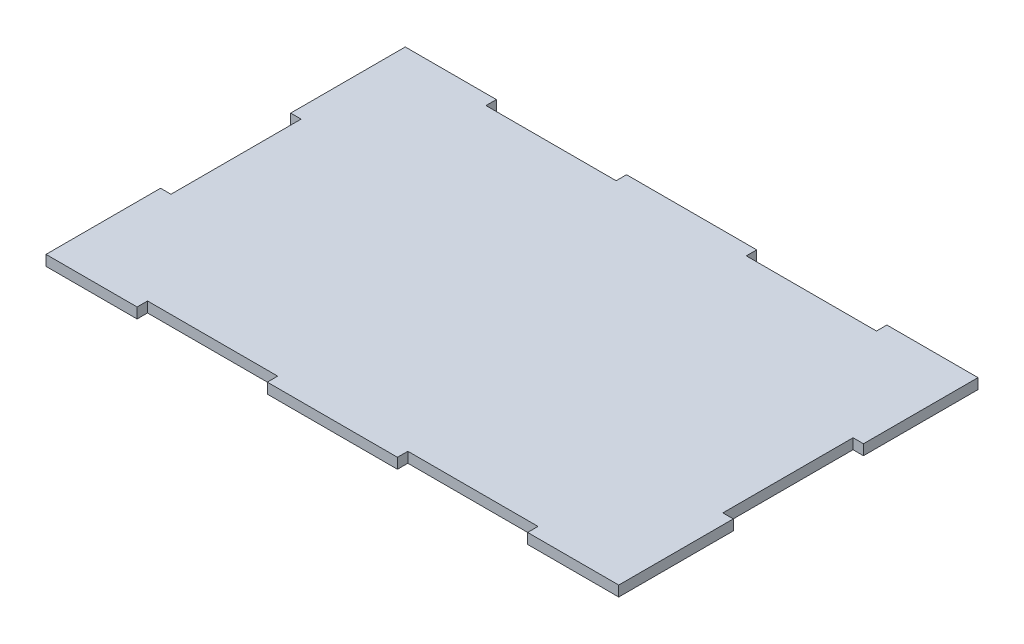
ISO-10303-21;
HEADER;
FILE_DESCRIPTION(('STEP AP214'),'2;1');
FILE_NAME('part.step','',(''),(''),'','','');
FILE_SCHEMA(('AUTOMOTIVE_DESIGN { 1 0 10303 214 1 1 1 1 }'));
ENDSEC;
DATA;
#1=APPLICATION_CONTEXT('core data for automotive mechanical design processes');
#2=APPLICATION_PROTOCOL_DEFINITION('international standard','automotive_design',2000,#1);
#3=PRODUCT_CONTEXT('',#1,'mechanical');
#4=PRODUCT('Part','Part','',(#3));
#5=PRODUCT_RELATED_PRODUCT_CATEGORY('part','',(#4));
#6=PRODUCT_DEFINITION_FORMATION('','',#4);
#7=PRODUCT_DEFINITION_CONTEXT('part definition',#1,'design');
#8=PRODUCT_DEFINITION('design','',#6,#7);
#9=PRODUCT_DEFINITION_SHAPE('','',#8);
#10=(LENGTH_UNIT() NAMED_UNIT(*) SI_UNIT(.MILLI.,.METRE.));
#11=(NAMED_UNIT(*) PLANE_ANGLE_UNIT() SI_UNIT($,.RADIAN.));
#12=(NAMED_UNIT(*) SI_UNIT($,.STERADIAN.) SOLID_ANGLE_UNIT());
#13=UNCERTAINTY_MEASURE_WITH_UNIT(LENGTH_MEASURE(1.E-05),#10,'distance_accuracy_value','');
#14=(GEOMETRIC_REPRESENTATION_CONTEXT(3) GLOBAL_UNCERTAINTY_ASSIGNED_CONTEXT((#13)) GLOBAL_UNIT_ASSIGNED_CONTEXT((#10,
#11,#12)) REPRESENTATION_CONTEXT('',''));
#15=CARTESIAN_POINT('',(0.,0.,0.));
#16=DIRECTION('',(0.,0.,1.));
#17=DIRECTION('',(1.,0.,0.));
#18=AXIS2_PLACEMENT_3D('',#15,#16,#17);
#19=CARTESIAN_POINT('',(-75.,4.,-69.));
#20=DIRECTION('',(0.,0.,1.));
#21=DIRECTION('',(1.,0.,0.));
#22=AXIS2_PLACEMENT_3D('',#19,#20,#21);
#23=PLANE('',#22);
#24=DIRECTION('',(-1.,0.,0.));
#25=VECTOR('',#24,1.);
#26=CARTESIAN_POINT('',(-75.,0.,-69.));
#27=LINE('',#26,#25);
#28=CARTESIAN_POINT('',(-75.,0.,-69.));
#29=VERTEX_POINT('',#28);
#30=CARTESIAN_POINT('',(-110.,0.,-69.));
#31=VERTEX_POINT('',#30);
#32=EDGE_CURVE('E266',#29,#31,#27,.T.);
#33=ORIENTED_EDGE('',*,*,#32,.T.);
#34=DIRECTION('',(0.,-1.,0.));
#35=VECTOR('',#34,1.);
#36=CARTESIAN_POINT('',(-110.,4.,-69.));
#37=LINE('',#36,#35);
#38=CARTESIAN_POINT('',(-110.,4.,-69.));
#39=VERTEX_POINT('',#38);
#40=EDGE_CURVE('E11',#39,#31,#37,.T.);
#41=ORIENTED_EDGE('',*,*,#40,.F.);
#42=DIRECTION('',(-1.,0.,0.));
#43=VECTOR('',#42,1.);
#44=CARTESIAN_POINT('',(-75.,4.,-69.));
#45=LINE('',#44,#43);
#46=CARTESIAN_POINT('',(-75.,4.,-69.));
#47=VERTEX_POINT('',#46);
#48=EDGE_CURVE('E348',#47,#39,#45,.T.);
#49=ORIENTED_EDGE('',*,*,#48,.F.);
#50=DIRECTION('',(0.,-1.,0.));
#51=VECTOR('',#50,1.);
#52=CARTESIAN_POINT('',(-75.,4.,-69.));
#53=LINE('',#52,#51);
#54=EDGE_CURVE('E262',#47,#29,#53,.T.);
#55=ORIENTED_EDGE('',*,*,#54,.T.);
#56=EDGE_LOOP('',(#33,#41,#49,#55));
#57=FACE_BOUND('',#56,.T.);
#58=ADVANCED_FACE('F45',(#57),#23,.F.);
#59=CARTESIAN_POINT('',(-110.,4.,-69.));
#60=DIRECTION('',(1.,0.,0.));
#61=DIRECTION('',(0.,0.,-1.));
#62=AXIS2_PLACEMENT_3D('',#59,#60,#61);
#63=PLANE('',#62);
#64=DIRECTION('',(0.,0.,1.));
#65=VECTOR('',#64,1.);
#66=CARTESIAN_POINT('',(-110.,0.,-69.));
#67=LINE('',#66,#65);
#68=CARTESIAN_POINT('',(-110.,0.,-25.));
#69=VERTEX_POINT('',#68);
#70=EDGE_CURVE('E270',#31,#69,#67,.T.);
#71=ORIENTED_EDGE('',*,*,#70,.T.);
#72=DIRECTION('',(0.,-1.,0.));
#73=VECTOR('',#72,1.);
#74=CARTESIAN_POINT('',(-110.,4.,-25.));
#75=LINE('',#74,#73);
#76=CARTESIAN_POINT('',(-110.,4.,-25.));
#77=VERTEX_POINT('',#76);
#78=EDGE_CURVE('E54',#77,#69,#75,.T.);
#79=ORIENTED_EDGE('',*,*,#78,.F.);
#80=DIRECTION('',(0.,0.,1.));
#81=VECTOR('',#80,1.);
#82=CARTESIAN_POINT('',(-110.,4.,-69.));
#83=LINE('',#82,#81);
#84=EDGE_CURVE('E165',#39,#77,#83,.T.);
#85=ORIENTED_EDGE('',*,*,#84,.F.);
#86=ORIENTED_EDGE('',*,*,#40,.T.);
#87=EDGE_LOOP('',(#71,#79,#85,#86));
#88=FACE_BOUND('',#87,.T.);
#89=ADVANCED_FACE('F554',(#88),#63,.F.);
#90=CARTESIAN_POINT('',(-110.,4.,-25.));
#91=DIRECTION('',(0.,0.,-1.));
#92=DIRECTION('',(-1.,0.,0.));
#93=AXIS2_PLACEMENT_3D('',#90,#91,#92);
#94=PLANE('',#93);
#95=DIRECTION('',(1.,0.,0.));
#96=VECTOR('',#95,1.);
#97=CARTESIAN_POINT('',(-110.,0.,-25.));
#98=LINE('',#97,#96);
#99=CARTESIAN_POINT('',(-106.,0.,-25.));
#100=VERTEX_POINT('',#99);
#101=EDGE_CURVE('E273',#69,#100,#98,.T.);
#102=ORIENTED_EDGE('',*,*,#101,.T.);
#103=DIRECTION('',(0.,-1.,0.));
#104=VECTOR('',#103,1.);
#105=CARTESIAN_POINT('',(-106.,4.,-25.));
#106=LINE('',#105,#104);
#107=CARTESIAN_POINT('',(-106.,4.,-25.));
#108=VERTEX_POINT('',#107);
#109=EDGE_CURVE('E439',#108,#100,#106,.T.);
#110=ORIENTED_EDGE('',*,*,#109,.F.);
#111=DIRECTION('',(1.,0.,0.));
#112=VECTOR('',#111,1.);
#113=CARTESIAN_POINT('',(-110.,4.,-25.));
#114=LINE('',#113,#112);
#115=EDGE_CURVE('E449',#77,#108,#114,.T.);
#116=ORIENTED_EDGE('',*,*,#115,.F.);
#117=ORIENTED_EDGE('',*,*,#78,.T.);
#118=EDGE_LOOP('',(#102,#110,#116,#117));
#119=FACE_BOUND('',#118,.T.);
#120=ADVANCED_FACE('F447',(#119),#94,.F.);
#121=CARTESIAN_POINT('',(-106.,4.,-25.));
#122=DIRECTION('',(1.,0.,0.));
#123=DIRECTION('',(0.,0.,-1.));
#124=AXIS2_PLACEMENT_3D('',#121,#122,#123);
#125=PLANE('',#124);
#126=DIRECTION('',(0.,0.,1.));
#127=VECTOR('',#126,1.);
#128=CARTESIAN_POINT('',(-106.,0.,-25.));
#129=LINE('',#128,#127);
#130=CARTESIAN_POINT('',(-106.,0.,25.));
#131=VERTEX_POINT('',#130);
#132=EDGE_CURVE('E276',#100,#131,#129,.T.);
#133=ORIENTED_EDGE('',*,*,#132,.T.);
#134=DIRECTION('',(0.,-1.,0.));
#135=VECTOR('',#134,1.);
#136=CARTESIAN_POINT('',(-106.,4.,25.));
#137=LINE('',#136,#135);
#138=CARTESIAN_POINT('',(-106.,4.,25.));
#139=VERTEX_POINT('',#138);
#140=EDGE_CURVE('E435',#139,#131,#137,.T.);
#141=ORIENTED_EDGE('',*,*,#140,.F.);
#142=DIRECTION('',(0.,0.,1.));
#143=VECTOR('',#142,1.);
#144=CARTESIAN_POINT('',(-106.,4.,-25.));
#145=LINE('',#144,#143);
#146=EDGE_CURVE('E468',#108,#139,#145,.T.);
#147=ORIENTED_EDGE('',*,*,#146,.F.);
#148=ORIENTED_EDGE('',*,*,#109,.T.);
#149=EDGE_LOOP('',(#133,#141,#147,#148));
#150=FACE_BOUND('',#149,.T.);
#151=ADVANCED_FACE('F458',(#150),#125,.F.);
#152=CARTESIAN_POINT('',(-106.,4.,25.));
#153=DIRECTION('',(0.,0.,1.));
#154=DIRECTION('',(1.,0.,0.));
#155=AXIS2_PLACEMENT_3D('',#152,#153,#154);
#156=PLANE('',#155);
#157=DIRECTION('',(-1.,0.,0.));
#158=VECTOR('',#157,1.);
#159=CARTESIAN_POINT('',(-106.,0.,25.));
#160=LINE('',#159,#158);
#161=CARTESIAN_POINT('',(-110.,0.,25.));
#162=VERTEX_POINT('',#161);
#163=EDGE_CURVE('E279',#131,#162,#160,.T.);
#164=ORIENTED_EDGE('',*,*,#163,.T.);
#165=DIRECTION('',(0.,-1.,0.));
#166=VECTOR('',#165,1.);
#167=CARTESIAN_POINT('',(-110.,4.,25.));
#168=LINE('',#167,#166);
#169=CARTESIAN_POINT('',(-110.,4.,25.));
#170=VERTEX_POINT('',#169);
#171=EDGE_CURVE('E431',#170,#162,#168,.T.);
#172=ORIENTED_EDGE('',*,*,#171,.F.);
#173=DIRECTION('',(-1.,0.,0.));
#174=VECTOR('',#173,1.);
#175=CARTESIAN_POINT('',(-106.,4.,25.));
#176=LINE('',#175,#174);
#177=EDGE_CURVE('E464',#139,#170,#176,.T.);
#178=ORIENTED_EDGE('',*,*,#177,.F.);
#179=ORIENTED_EDGE('',*,*,#140,.T.);
#180=EDGE_LOOP('',(#164,#172,#178,#179));
#181=FACE_BOUND('',#180,.T.);
#182=ADVANCED_FACE('F462',(#181),#156,.F.);
#183=CARTESIAN_POINT('',(-110.,4.,25.));
#184=DIRECTION('',(1.,0.,0.));
#185=DIRECTION('',(0.,0.,-1.));
#186=AXIS2_PLACEMENT_3D('',#183,#184,#185);
#187=PLANE('',#186);
#188=DIRECTION('',(0.,0.,1.));
#189=VECTOR('',#188,1.);
#190=CARTESIAN_POINT('',(-110.,0.,25.));
#191=LINE('',#190,#189);
#192=CARTESIAN_POINT('',(-110.,0.,69.));
#193=VERTEX_POINT('',#192);
#194=EDGE_CURVE('E282',#162,#193,#191,.T.);
#195=ORIENTED_EDGE('',*,*,#194,.T.);
#196=DIRECTION('',(0.,-1.,0.));
#197=VECTOR('',#196,1.);
#198=CARTESIAN_POINT('',(-110.,4.,69.));
#199=LINE('',#198,#197);
#200=CARTESIAN_POINT('',(-110.,4.,69.));
#201=VERTEX_POINT('',#200);
#202=EDGE_CURVE('E427',#201,#193,#199,.T.);
#203=ORIENTED_EDGE('',*,*,#202,.F.);
#204=DIRECTION('',(0.,0.,1.));
#205=VECTOR('',#204,1.);
#206=CARTESIAN_POINT('',(-110.,4.,25.));
#207=LINE('',#206,#205);
#208=EDGE_CURVE('E467',#170,#201,#207,.T.);
#209=ORIENTED_EDGE('',*,*,#208,.F.);
#210=ORIENTED_EDGE('',*,*,#171,.T.);
#211=EDGE_LOOP('',(#195,#203,#209,#210));
#212=FACE_BOUND('',#211,.T.);
#213=ADVANCED_FACE('F567',(#212),#187,.F.);
#214=CARTESIAN_POINT('',(-110.,4.,69.));
#215=DIRECTION('',(0.,0.,-1.));
#216=DIRECTION('',(-1.,0.,0.));
#217=AXIS2_PLACEMENT_3D('',#214,#215,#216);
#218=PLANE('',#217);
#219=DIRECTION('',(1.,0.,0.));
#220=VECTOR('',#219,1.);
#221=CARTESIAN_POINT('',(-110.,0.,69.));
#222=LINE('',#221,#220);
#223=CARTESIAN_POINT('',(-75.,0.,69.));
#224=VERTEX_POINT('',#223);
#225=EDGE_CURVE('E285',#193,#224,#222,.T.);
#226=ORIENTED_EDGE('',*,*,#225,.T.);
#227=DIRECTION('',(0.,-1.,0.));
#228=VECTOR('',#227,1.);
#229=CARTESIAN_POINT('',(-75.,4.,69.));
#230=LINE('',#229,#228);
#231=CARTESIAN_POINT('',(-75.,4.,69.));
#232=VERTEX_POINT('',#231);
#233=EDGE_CURVE('E423',#232,#224,#230,.T.);
#234=ORIENTED_EDGE('',*,*,#233,.F.);
#235=DIRECTION('',(1.,0.,0.));
#236=VECTOR('',#235,1.);
#237=CARTESIAN_POINT('',(-110.,4.,69.));
#238=LINE('',#237,#236);
#239=EDGE_CURVE('E472',#201,#232,#238,.T.);
#240=ORIENTED_EDGE('',*,*,#239,.F.);
#241=ORIENTED_EDGE('',*,*,#202,.T.);
#242=EDGE_LOOP('',(#226,#234,#240,#241));
#243=FACE_BOUND('',#242,.T.);
#244=ADVANCED_FACE('F570',(#243),#218,.F.);
#245=CARTESIAN_POINT('',(-75.,4.,69.));
#246=DIRECTION('',(-1.,0.,0.));
#247=DIRECTION('',(0.,0.,1.));
#248=AXIS2_PLACEMENT_3D('',#245,#246,#247);
#249=PLANE('',#248);
#250=DIRECTION('',(0.,0.,-1.));
#251=VECTOR('',#250,1.);
#252=CARTESIAN_POINT('',(-75.,0.,69.));
#253=LINE('',#252,#251);
#254=CARTESIAN_POINT('',(-75.,0.,65.));
#255=VERTEX_POINT('',#254);
#256=EDGE_CURVE('E288',#224,#255,#253,.T.);
#257=ORIENTED_EDGE('',*,*,#256,.T.);
#258=DIRECTION('',(0.,-1.,0.));
#259=VECTOR('',#258,1.);
#260=CARTESIAN_POINT('',(-75.,4.,65.));
#261=LINE('',#260,#259);
#262=CARTESIAN_POINT('',(-75.,4.,65.));
#263=VERTEX_POINT('',#262);
#264=EDGE_CURVE('E419',#263,#255,#261,.T.);
#265=ORIENTED_EDGE('',*,*,#264,.F.);
#266=DIRECTION('',(0.,0.,-1.));
#267=VECTOR('',#266,1.);
#268=CARTESIAN_POINT('',(-75.,4.,69.));
#269=LINE('',#268,#267);
#270=EDGE_CURVE('E479',#232,#263,#269,.T.);
#271=ORIENTED_EDGE('',*,*,#270,.F.);
#272=ORIENTED_EDGE('',*,*,#233,.T.);
#273=EDGE_LOOP('',(#257,#265,#271,#272));
#274=FACE_BOUND('',#273,.T.);
#275=ADVANCED_FACE('F574',(#274),#249,.F.);
#276=CARTESIAN_POINT('',(-75.,4.,65.));
#277=DIRECTION('',(0.,0.,-1.));
#278=DIRECTION('',(-1.,0.,0.));
#279=AXIS2_PLACEMENT_3D('',#276,#277,#278);
#280=PLANE('',#279);
#281=DIRECTION('',(1.,0.,0.));
#282=VECTOR('',#281,1.);
#283=CARTESIAN_POINT('',(-75.,0.,65.));
#284=LINE('',#283,#282);
#285=CARTESIAN_POINT('',(-25.,0.,65.));
#286=VERTEX_POINT('',#285);
#287=EDGE_CURVE('E291',#255,#286,#284,.T.);
#288=ORIENTED_EDGE('',*,*,#287,.T.);
#289=DIRECTION('',(0.,-1.,0.));
#290=VECTOR('',#289,1.);
#291=CARTESIAN_POINT('',(-25.,4.,65.));
#292=LINE('',#291,#290);
#293=CARTESIAN_POINT('',(-25.,4.,65.));
#294=VERTEX_POINT('',#293);
#295=EDGE_CURVE('E415',#294,#286,#292,.T.);
#296=ORIENTED_EDGE('',*,*,#295,.F.);
#297=DIRECTION('',(1.,0.,0.));
#298=VECTOR('',#297,1.);
#299=CARTESIAN_POINT('',(-75.,4.,65.));
#300=LINE('',#299,#298);
#301=EDGE_CURVE('E482',#263,#294,#300,.T.);
#302=ORIENTED_EDGE('',*,*,#301,.F.);
#303=ORIENTED_EDGE('',*,*,#264,.T.);
#304=EDGE_LOOP('',(#288,#296,#302,#303));
#305=FACE_BOUND('',#304,.T.);
#306=ADVANCED_FACE('F578',(#305),#280,.F.);
#307=CARTESIAN_POINT('',(-25.,4.,65.));
#308=DIRECTION('',(1.,0.,0.));
#309=DIRECTION('',(0.,0.,-1.));
#310=AXIS2_PLACEMENT_3D('',#307,#308,#309);
#311=PLANE('',#310);
#312=DIRECTION('',(0.,0.,1.));
#313=VECTOR('',#312,1.);
#314=CARTESIAN_POINT('',(-25.,0.,65.));
#315=LINE('',#314,#313);
#316=CARTESIAN_POINT('',(-25.,0.,69.));
#317=VERTEX_POINT('',#316);
#318=EDGE_CURVE('E294',#286,#317,#315,.T.);
#319=ORIENTED_EDGE('',*,*,#318,.T.);
#320=DIRECTION('',(0.,-1.,0.));
#321=VECTOR('',#320,1.);
#322=CARTESIAN_POINT('',(-25.,4.,69.));
#323=LINE('',#322,#321);
#324=CARTESIAN_POINT('',(-25.,4.,69.));
#325=VERTEX_POINT('',#324);
#326=EDGE_CURVE('E411',#325,#317,#323,.T.);
#327=ORIENTED_EDGE('',*,*,#326,.F.);
#328=DIRECTION('',(0.,0.,1.));
#329=VECTOR('',#328,1.);
#330=CARTESIAN_POINT('',(-25.,4.,65.));
#331=LINE('',#330,#329);
#332=EDGE_CURVE('E485',#294,#325,#331,.T.);
#333=ORIENTED_EDGE('',*,*,#332,.F.);
#334=ORIENTED_EDGE('',*,*,#295,.T.);
#335=EDGE_LOOP('',(#319,#327,#333,#334));
#336=FACE_BOUND('',#335,.T.);
#337=ADVANCED_FACE('F582',(#336),#311,.F.);
#338=CARTESIAN_POINT('',(-25.,4.,69.));
#339=DIRECTION('',(0.,0.,-1.));
#340=DIRECTION('',(-1.,0.,0.));
#341=AXIS2_PLACEMENT_3D('',#338,#339,#340);
#342=PLANE('',#341);
#343=DIRECTION('',(1.,0.,0.));
#344=VECTOR('',#343,1.);
#345=CARTESIAN_POINT('',(-25.,0.,69.));
#346=LINE('',#345,#344);
#347=CARTESIAN_POINT('',(25.,0.,69.));
#348=VERTEX_POINT('',#347);
#349=EDGE_CURVE('E297',#317,#348,#346,.T.);
#350=ORIENTED_EDGE('',*,*,#349,.T.);
#351=DIRECTION('',(0.,-1.,0.));
#352=VECTOR('',#351,1.);
#353=CARTESIAN_POINT('',(25.,4.,69.));
#354=LINE('',#353,#352);
#355=CARTESIAN_POINT('',(25.,4.,69.));
#356=VERTEX_POINT('',#355);
#357=EDGE_CURVE('E407',#356,#348,#354,.T.);
#358=ORIENTED_EDGE('',*,*,#357,.F.);
#359=DIRECTION('',(1.,0.,0.));
#360=VECTOR('',#359,1.);
#361=CARTESIAN_POINT('',(-25.,4.,69.));
#362=LINE('',#361,#360);
#363=EDGE_CURVE('E488',#325,#356,#362,.T.);
#364=ORIENTED_EDGE('',*,*,#363,.F.);
#365=ORIENTED_EDGE('',*,*,#326,.T.);
#366=EDGE_LOOP('',(#350,#358,#364,#365));
#367=FACE_BOUND('',#366,.T.);
#368=ADVANCED_FACE('F586',(#367),#342,.F.);
#369=CARTESIAN_POINT('',(25.,4.,69.));
#370=DIRECTION('',(-1.,0.,0.));
#371=DIRECTION('',(0.,0.,1.));
#372=AXIS2_PLACEMENT_3D('',#369,#370,#371);
#373=PLANE('',#372);
#374=DIRECTION('',(0.,0.,-1.));
#375=VECTOR('',#374,1.);
#376=CARTESIAN_POINT('',(25.,0.,69.));
#377=LINE('',#376,#375);
#378=CARTESIAN_POINT('',(25.,0.,65.));
#379=VERTEX_POINT('',#378);
#380=EDGE_CURVE('E300',#348,#379,#377,.T.);
#381=ORIENTED_EDGE('',*,*,#380,.T.);
#382=DIRECTION('',(0.,-1.,0.));
#383=VECTOR('',#382,1.);
#384=CARTESIAN_POINT('',(25.,4.,65.));
#385=LINE('',#384,#383);
#386=CARTESIAN_POINT('',(25.,4.,65.));
#387=VERTEX_POINT('',#386);
#388=EDGE_CURVE('E403',#387,#379,#385,.T.);
#389=ORIENTED_EDGE('',*,*,#388,.F.);
#390=DIRECTION('',(0.,0.,-1.));
#391=VECTOR('',#390,1.);
#392=CARTESIAN_POINT('',(25.,4.,69.));
#393=LINE('',#392,#391);
#394=EDGE_CURVE('E491',#356,#387,#393,.T.);
#395=ORIENTED_EDGE('',*,*,#394,.F.);
#396=ORIENTED_EDGE('',*,*,#357,.T.);
#397=EDGE_LOOP('',(#381,#389,#395,#396));
#398=FACE_BOUND('',#397,.T.);
#399=ADVANCED_FACE('F590',(#398),#373,.F.);
#400=CARTESIAN_POINT('',(25.,4.,65.));
#401=DIRECTION('',(0.,0.,-1.));
#402=DIRECTION('',(-1.,0.,0.));
#403=AXIS2_PLACEMENT_3D('',#400,#401,#402);
#404=PLANE('',#403);
#405=DIRECTION('',(1.,0.,0.));
#406=VECTOR('',#405,1.);
#407=CARTESIAN_POINT('',(25.,0.,65.));
#408=LINE('',#407,#406);
#409=CARTESIAN_POINT('',(75.,0.,65.));
#410=VERTEX_POINT('',#409);
#411=EDGE_CURVE('E303',#379,#410,#408,.T.);
#412=ORIENTED_EDGE('',*,*,#411,.T.);
#413=DIRECTION('',(0.,-1.,0.));
#414=VECTOR('',#413,1.);
#415=CARTESIAN_POINT('',(75.,4.,65.));
#416=LINE('',#415,#414);
#417=CARTESIAN_POINT('',(75.,4.,65.));
#418=VERTEX_POINT('',#417);
#419=EDGE_CURVE('E399',#418,#410,#416,.T.);
#420=ORIENTED_EDGE('',*,*,#419,.F.);
#421=DIRECTION('',(1.,0.,0.));
#422=VECTOR('',#421,1.);
#423=CARTESIAN_POINT('',(25.,4.,65.));
#424=LINE('',#423,#422);
#425=EDGE_CURVE('E494',#387,#418,#424,.T.);
#426=ORIENTED_EDGE('',*,*,#425,.F.);
#427=ORIENTED_EDGE('',*,*,#388,.T.);
#428=EDGE_LOOP('',(#412,#420,#426,#427));
#429=FACE_BOUND('',#428,.T.);
#430=ADVANCED_FACE('F594',(#429),#404,.F.);
#431=CARTESIAN_POINT('',(75.,4.,65.));
#432=DIRECTION('',(1.,0.,0.));
#433=DIRECTION('',(0.,0.,-1.));
#434=AXIS2_PLACEMENT_3D('',#431,#432,#433);
#435=PLANE('',#434);
#436=DIRECTION('',(0.,0.,1.));
#437=VECTOR('',#436,1.);
#438=CARTESIAN_POINT('',(75.,0.,65.));
#439=LINE('',#438,#437);
#440=CARTESIAN_POINT('',(75.,0.,69.));
#441=VERTEX_POINT('',#440);
#442=EDGE_CURVE('E306',#410,#441,#439,.T.);
#443=ORIENTED_EDGE('',*,*,#442,.T.);
#444=DIRECTION('',(0.,-1.,0.));
#445=VECTOR('',#444,1.);
#446=CARTESIAN_POINT('',(75.,4.,69.));
#447=LINE('',#446,#445);
#448=CARTESIAN_POINT('',(75.,4.,69.));
#449=VERTEX_POINT('',#448);
#450=EDGE_CURVE('E395',#449,#441,#447,.T.);
#451=ORIENTED_EDGE('',*,*,#450,.F.);
#452=DIRECTION('',(0.,0.,1.));
#453=VECTOR('',#452,1.);
#454=CARTESIAN_POINT('',(75.,4.,65.));
#455=LINE('',#454,#453);
#456=EDGE_CURVE('E497',#418,#449,#455,.T.);
#457=ORIENTED_EDGE('',*,*,#456,.F.);
#458=ORIENTED_EDGE('',*,*,#419,.T.);
#459=EDGE_LOOP('',(#443,#451,#457,#458));
#460=FACE_BOUND('',#459,.T.);
#461=ADVANCED_FACE('F598',(#460),#435,.F.);
#462=CARTESIAN_POINT('',(75.,4.,69.));
#463=DIRECTION('',(0.,0.,-1.));
#464=DIRECTION('',(-1.,0.,0.));
#465=AXIS2_PLACEMENT_3D('',#462,#463,#464);
#466=PLANE('',#465);
#467=DIRECTION('',(1.,0.,0.));
#468=VECTOR('',#467,1.);
#469=CARTESIAN_POINT('',(75.,0.,69.));
#470=LINE('',#469,#468);
#471=CARTESIAN_POINT('',(110.,0.,69.));
#472=VERTEX_POINT('',#471);
#473=EDGE_CURVE('E309',#441,#472,#470,.T.);
#474=ORIENTED_EDGE('',*,*,#473,.T.);
#475=DIRECTION('',(0.,-1.,0.));
#476=VECTOR('',#475,1.);
#477=CARTESIAN_POINT('',(110.,4.,69.));
#478=LINE('',#477,#476);
#479=CARTESIAN_POINT('',(110.,4.,69.));
#480=VERTEX_POINT('',#479);
#481=EDGE_CURVE('E391',#480,#472,#478,.T.);
#482=ORIENTED_EDGE('',*,*,#481,.F.);
#483=DIRECTION('',(1.,0.,0.));
#484=VECTOR('',#483,1.);
#485=CARTESIAN_POINT('',(75.,4.,69.));
#486=LINE('',#485,#484);
#487=EDGE_CURVE('E500',#449,#480,#486,.T.);
#488=ORIENTED_EDGE('',*,*,#487,.F.);
#489=ORIENTED_EDGE('',*,*,#450,.T.);
#490=EDGE_LOOP('',(#474,#482,#488,#489));
#491=FACE_BOUND('',#490,.T.);
#492=ADVANCED_FACE('F602',(#491),#466,.F.);
#493=CARTESIAN_POINT('',(110.,4.,69.));
#494=DIRECTION('',(-1.,0.,0.));
#495=DIRECTION('',(0.,0.,1.));
#496=AXIS2_PLACEMENT_3D('',#493,#494,#495);
#497=PLANE('',#496);
#498=DIRECTION('',(0.,0.,-1.));
#499=VECTOR('',#498,1.);
#500=CARTESIAN_POINT('',(110.,0.,69.));
#501=LINE('',#500,#499);
#502=CARTESIAN_POINT('',(110.,0.,25.));
#503=VERTEX_POINT('',#502);
#504=EDGE_CURVE('E312',#472,#503,#501,.T.);
#505=ORIENTED_EDGE('',*,*,#504,.T.);
#506=DIRECTION('',(0.,-1.,0.));
#507=VECTOR('',#506,1.);
#508=CARTESIAN_POINT('',(110.,4.,25.));
#509=LINE('',#508,#507);
#510=CARTESIAN_POINT('',(110.,4.,25.));
#511=VERTEX_POINT('',#510);
#512=EDGE_CURVE('E387',#511,#503,#509,.T.);
#513=ORIENTED_EDGE('',*,*,#512,.F.);
#514=DIRECTION('',(0.,0.,-1.));
#515=VECTOR('',#514,1.);
#516=CARTESIAN_POINT('',(110.,4.,69.));
#517=LINE('',#516,#515);
#518=EDGE_CURVE('E503',#480,#511,#517,.T.);
#519=ORIENTED_EDGE('',*,*,#518,.F.);
#520=ORIENTED_EDGE('',*,*,#481,.T.);
#521=EDGE_LOOP('',(#505,#513,#519,#520));
#522=FACE_BOUND('',#521,.T.);
#523=ADVANCED_FACE('F606',(#522),#497,.F.);
#524=CARTESIAN_POINT('',(106.,4.,25.));
#525=DIRECTION('',(0.,0.,1.));
#526=DIRECTION('',(1.,0.,0.));
#527=AXIS2_PLACEMENT_3D('',#524,#525,#526);
#528=PLANE('',#527);
#529=DIRECTION('',(-1.,0.,0.));
#530=VECTOR('',#529,1.);
#531=CARTESIAN_POINT('',(106.,0.,25.));
#532=LINE('',#531,#530);
#533=CARTESIAN_POINT('',(106.,0.,25.));
#534=VERTEX_POINT('',#533);
#535=EDGE_CURVE('E315',#503,#534,#532,.T.);
#536=ORIENTED_EDGE('',*,*,#535,.T.);
#537=DIRECTION('',(0.,-1.,0.));
#538=VECTOR('',#537,1.);
#539=CARTESIAN_POINT('',(106.,4.,25.));
#540=LINE('',#539,#538);
#541=CARTESIAN_POINT('',(106.,4.,25.));
#542=VERTEX_POINT('',#541);
#543=EDGE_CURVE('E383',#542,#534,#540,.T.);
#544=ORIENTED_EDGE('',*,*,#543,.F.);
#545=DIRECTION('',(-1.,0.,0.));
#546=VECTOR('',#545,1.);
#547=CARTESIAN_POINT('',(106.,4.,25.));
#548=LINE('',#547,#546);
#549=EDGE_CURVE('E506',#511,#542,#548,.T.);
#550=ORIENTED_EDGE('',*,*,#549,.F.);
#551=ORIENTED_EDGE('',*,*,#512,.T.);
#552=EDGE_LOOP('',(#536,#544,#550,#551));
#553=FACE_BOUND('',#552,.T.);
#554=ADVANCED_FACE('F610',(#553),#528,.F.);
#555=CARTESIAN_POINT('',(106.,4.,-25.));
#556=DIRECTION('',(-1.,0.,0.));
#557=DIRECTION('',(0.,0.,1.));
#558=AXIS2_PLACEMENT_3D('',#555,#556,#557);
#559=PLANE('',#558);
#560=DIRECTION('',(0.,0.,-1.));
#561=VECTOR('',#560,1.);
#562=CARTESIAN_POINT('',(106.,0.,-25.));
#563=LINE('',#562,#561);
#564=CARTESIAN_POINT('',(106.,0.,-25.));
#565=VERTEX_POINT('',#564);
#566=EDGE_CURVE('E318',#534,#565,#563,.T.);
#567=ORIENTED_EDGE('',*,*,#566,.T.);
#568=DIRECTION('',(0.,-1.,0.));
#569=VECTOR('',#568,1.);
#570=CARTESIAN_POINT('',(106.,4.,-25.));
#571=LINE('',#570,#569);
#572=CARTESIAN_POINT('',(106.,4.,-25.));
#573=VERTEX_POINT('',#572);
#574=EDGE_CURVE('E379',#573,#565,#571,.T.);
#575=ORIENTED_EDGE('',*,*,#574,.F.);
#576=DIRECTION('',(0.,0.,-1.));
#577=VECTOR('',#576,1.);
#578=CARTESIAN_POINT('',(106.,4.,-25.));
#579=LINE('',#578,#577);
#580=EDGE_CURVE('E509',#542,#573,#579,.T.);
#581=ORIENTED_EDGE('',*,*,#580,.F.);
#582=ORIENTED_EDGE('',*,*,#543,.T.);
#583=EDGE_LOOP('',(#567,#575,#581,#582));
#584=FACE_BOUND('',#583,.T.);
#585=ADVANCED_FACE('F614',(#584),#559,.F.);
#586=CARTESIAN_POINT('',(110.,4.,-25.));
#587=DIRECTION('',(0.,0.,-1.));
#588=DIRECTION('',(-1.,0.,0.));
#589=AXIS2_PLACEMENT_3D('',#586,#587,#588);
#590=PLANE('',#589);
#591=DIRECTION('',(1.,0.,0.));
#592=VECTOR('',#591,1.);
#593=CARTESIAN_POINT('',(110.,0.,-25.));
#594=LINE('',#593,#592);
#595=CARTESIAN_POINT('',(110.,0.,-25.));
#596=VERTEX_POINT('',#595);
#597=EDGE_CURVE('E321',#565,#596,#594,.T.);
#598=ORIENTED_EDGE('',*,*,#597,.T.);
#599=DIRECTION('',(0.,-1.,0.));
#600=VECTOR('',#599,1.);
#601=CARTESIAN_POINT('',(110.,4.,-25.));
#602=LINE('',#601,#600);
#603=CARTESIAN_POINT('',(110.,4.,-25.));
#604=VERTEX_POINT('',#603);
#605=EDGE_CURVE('E375',#604,#596,#602,.T.);
#606=ORIENTED_EDGE('',*,*,#605,.F.);
#607=DIRECTION('',(1.,0.,0.));
#608=VECTOR('',#607,1.);
#609=CARTESIAN_POINT('',(110.,4.,-25.));
#610=LINE('',#609,#608);
#611=EDGE_CURVE('E512',#573,#604,#610,.T.);
#612=ORIENTED_EDGE('',*,*,#611,.F.);
#613=ORIENTED_EDGE('',*,*,#574,.T.);
#614=EDGE_LOOP('',(#598,#606,#612,#613));
#615=FACE_BOUND('',#614,.T.);
#616=ADVANCED_FACE('F618',(#615),#590,.F.);
#617=CARTESIAN_POINT('',(110.,4.,-25.));
#618=DIRECTION('',(-1.,0.,0.));
#619=DIRECTION('',(0.,0.,1.));
#620=AXIS2_PLACEMENT_3D('',#617,#618,#619);
#621=PLANE('',#620);
#622=DIRECTION('',(0.,0.,-1.));
#623=VECTOR('',#622,1.);
#624=CARTESIAN_POINT('',(110.,0.,-25.));
#625=LINE('',#624,#623);
#626=CARTESIAN_POINT('',(110.,0.,-69.));
#627=VERTEX_POINT('',#626);
#628=EDGE_CURVE('E324',#596,#627,#625,.T.);
#629=ORIENTED_EDGE('',*,*,#628,.T.);
#630=DIRECTION('',(0.,-1.,0.));
#631=VECTOR('',#630,1.);
#632=CARTESIAN_POINT('',(110.,4.,-69.));
#633=LINE('',#632,#631);
#634=CARTESIAN_POINT('',(110.,4.,-69.));
#635=VERTEX_POINT('',#634);
#636=EDGE_CURVE('E371',#635,#627,#633,.T.);
#637=ORIENTED_EDGE('',*,*,#636,.F.);
#638=DIRECTION('',(0.,0.,-1.));
#639=VECTOR('',#638,1.);
#640=CARTESIAN_POINT('',(110.,4.,-25.));
#641=LINE('',#640,#639);
#642=EDGE_CURVE('E515',#604,#635,#641,.T.);
#643=ORIENTED_EDGE('',*,*,#642,.F.);
#644=ORIENTED_EDGE('',*,*,#605,.T.);
#645=EDGE_LOOP('',(#629,#637,#643,#644));
#646=FACE_BOUND('',#645,.T.);
#647=ADVANCED_FACE('F622',(#646),#621,.F.);
#648=CARTESIAN_POINT('',(110.,4.,-69.));
#649=DIRECTION('',(0.,0.,1.));
#650=DIRECTION('',(1.,0.,0.));
#651=AXIS2_PLACEMENT_3D('',#648,#649,#650);
#652=PLANE('',#651);
#653=DIRECTION('',(-1.,0.,0.));
#654=VECTOR('',#653,1.);
#655=CARTESIAN_POINT('',(110.,0.,-69.));
#656=LINE('',#655,#654);
#657=CARTESIAN_POINT('',(75.,0.,-69.));
#658=VERTEX_POINT('',#657);
#659=EDGE_CURVE('E327',#627,#658,#656,.T.);
#660=ORIENTED_EDGE('',*,*,#659,.T.);
#661=DIRECTION('',(0.,-1.,0.));
#662=VECTOR('',#661,1.);
#663=CARTESIAN_POINT('',(75.,4.,-69.));
#664=LINE('',#663,#662);
#665=CARTESIAN_POINT('',(75.,4.,-69.));
#666=VERTEX_POINT('',#665);
#667=EDGE_CURVE('E367',#666,#658,#664,.T.);
#668=ORIENTED_EDGE('',*,*,#667,.F.);
#669=DIRECTION('',(-1.,0.,0.));
#670=VECTOR('',#669,1.);
#671=CARTESIAN_POINT('',(110.,4.,-69.));
#672=LINE('',#671,#670);
#673=EDGE_CURVE('E518',#635,#666,#672,.T.);
#674=ORIENTED_EDGE('',*,*,#673,.F.);
#675=ORIENTED_EDGE('',*,*,#636,.T.);
#676=EDGE_LOOP('',(#660,#668,#674,#675));
#677=FACE_BOUND('',#676,.T.);
#678=ADVANCED_FACE('F626',(#677),#652,.F.);
#679=CARTESIAN_POINT('',(75.,4.,-65.));
#680=DIRECTION('',(1.,0.,0.));
#681=DIRECTION('',(0.,0.,-1.));
#682=AXIS2_PLACEMENT_3D('',#679,#680,#681);
#683=PLANE('',#682);
#684=DIRECTION('',(0.,0.,1.));
#685=VECTOR('',#684,1.);
#686=CARTESIAN_POINT('',(75.,0.,-65.));
#687=LINE('',#686,#685);
#688=CARTESIAN_POINT('',(75.,0.,-65.));
#689=VERTEX_POINT('',#688);
#690=EDGE_CURVE('E330',#658,#689,#687,.T.);
#691=ORIENTED_EDGE('',*,*,#690,.T.);
#692=DIRECTION('',(0.,-1.,0.));
#693=VECTOR('',#692,1.);
#694=CARTESIAN_POINT('',(75.,4.,-65.));
#695=LINE('',#694,#693);
#696=CARTESIAN_POINT('',(75.,4.,-65.));
#697=VERTEX_POINT('',#696);
#698=EDGE_CURVE('E363',#697,#689,#695,.T.);
#699=ORIENTED_EDGE('',*,*,#698,.F.);
#700=DIRECTION('',(0.,0.,1.));
#701=VECTOR('',#700,1.);
#702=CARTESIAN_POINT('',(75.,4.,-65.));
#703=LINE('',#702,#701);
#704=EDGE_CURVE('E521',#666,#697,#703,.T.);
#705=ORIENTED_EDGE('',*,*,#704,.F.);
#706=ORIENTED_EDGE('',*,*,#667,.T.);
#707=EDGE_LOOP('',(#691,#699,#705,#706));
#708=FACE_BOUND('',#707,.T.);
#709=ADVANCED_FACE('F630',(#708),#683,.F.);
#710=CARTESIAN_POINT('',(25.,4.,-65.));
#711=DIRECTION('',(0.,0.,1.));
#712=DIRECTION('',(1.,0.,0.));
#713=AXIS2_PLACEMENT_3D('',#710,#711,#712);
#714=PLANE('',#713);
#715=DIRECTION('',(-1.,0.,0.));
#716=VECTOR('',#715,1.);
#717=CARTESIAN_POINT('',(25.,0.,-65.));
#718=LINE('',#717,#716);
#719=CARTESIAN_POINT('',(25.,0.,-65.));
#720=VERTEX_POINT('',#719);
#721=EDGE_CURVE('E333',#689,#720,#718,.T.);
#722=ORIENTED_EDGE('',*,*,#721,.T.);
#723=DIRECTION('',(0.,-1.,0.));
#724=VECTOR('',#723,1.);
#725=CARTESIAN_POINT('',(25.,4.,-65.));
#726=LINE('',#725,#724);
#727=CARTESIAN_POINT('',(25.,4.,-65.));
#728=VERTEX_POINT('',#727);
#729=EDGE_CURVE('E359',#728,#720,#726,.T.);
#730=ORIENTED_EDGE('',*,*,#729,.F.);
#731=DIRECTION('',(-1.,0.,0.));
#732=VECTOR('',#731,1.);
#733=CARTESIAN_POINT('',(25.,4.,-65.));
#734=LINE('',#733,#732);
#735=EDGE_CURVE('E524',#697,#728,#734,.T.);
#736=ORIENTED_EDGE('',*,*,#735,.F.);
#737=ORIENTED_EDGE('',*,*,#698,.T.);
#738=EDGE_LOOP('',(#722,#730,#736,#737));
#739=FACE_BOUND('',#738,.T.);
#740=ADVANCED_FACE('F634',(#739),#714,.F.);
#741=CARTESIAN_POINT('',(25.,4.,-69.));
#742=DIRECTION('',(-1.,0.,0.));
#743=DIRECTION('',(0.,0.,1.));
#744=AXIS2_PLACEMENT_3D('',#741,#742,#743);
#745=PLANE('',#744);
#746=DIRECTION('',(0.,0.,-1.));
#747=VECTOR('',#746,1.);
#748=CARTESIAN_POINT('',(25.,0.,-69.));
#749=LINE('',#748,#747);
#750=CARTESIAN_POINT('',(25.,0.,-69.));
#751=VERTEX_POINT('',#750);
#752=EDGE_CURVE('E336',#720,#751,#749,.T.);
#753=ORIENTED_EDGE('',*,*,#752,.T.);
#754=DIRECTION('',(0.,-1.,0.));
#755=VECTOR('',#754,1.);
#756=CARTESIAN_POINT('',(25.,4.,-69.));
#757=LINE('',#756,#755);
#758=CARTESIAN_POINT('',(25.,4.,-69.));
#759=VERTEX_POINT('',#758);
#760=EDGE_CURVE('E355',#759,#751,#757,.T.);
#761=ORIENTED_EDGE('',*,*,#760,.F.);
#762=DIRECTION('',(0.,0.,-1.));
#763=VECTOR('',#762,1.);
#764=CARTESIAN_POINT('',(25.,4.,-69.));
#765=LINE('',#764,#763);
#766=EDGE_CURVE('E527',#728,#759,#765,.T.);
#767=ORIENTED_EDGE('',*,*,#766,.F.);
#768=ORIENTED_EDGE('',*,*,#729,.T.);
#769=EDGE_LOOP('',(#753,#761,#767,#768));
#770=FACE_BOUND('',#769,.T.);
#771=ADVANCED_FACE('F535',(#770),#745,.F.);
#772=CARTESIAN_POINT('',(25.,4.,-69.));
#773=DIRECTION('',(0.,0.,1.));
#774=DIRECTION('',(1.,0.,0.));
#775=AXIS2_PLACEMENT_3D('',#772,#773,#774);
#776=PLANE('',#775);
#777=DIRECTION('',(-1.,0.,0.));
#778=VECTOR('',#777,1.);
#779=CARTESIAN_POINT('',(25.,0.,-69.));
#780=LINE('',#779,#778);
#781=CARTESIAN_POINT('',(-25.,0.,-69.));
#782=VERTEX_POINT('',#781);
#783=EDGE_CURVE('E339',#751,#782,#780,.T.);
#784=ORIENTED_EDGE('',*,*,#783,.T.);
#785=DIRECTION('',(0.,-1.,0.));
#786=VECTOR('',#785,1.);
#787=CARTESIAN_POINT('',(-25.,4.,-69.));
#788=LINE('',#787,#786);
#789=CARTESIAN_POINT('',(-25.,4.,-69.));
#790=VERTEX_POINT('',#789);
#791=EDGE_CURVE('E255',#790,#782,#788,.T.);
#792=ORIENTED_EDGE('',*,*,#791,.F.);
#793=DIRECTION('',(-1.,0.,0.));
#794=VECTOR('',#793,1.);
#795=CARTESIAN_POINT('',(25.,4.,-69.));
#796=LINE('',#795,#794);
#797=EDGE_CURVE('E244',#759,#790,#796,.T.);
#798=ORIENTED_EDGE('',*,*,#797,.F.);
#799=ORIENTED_EDGE('',*,*,#760,.T.);
#800=EDGE_LOOP('',(#784,#792,#798,#799));
#801=FACE_BOUND('',#800,.T.);
#802=ADVANCED_FACE('F539',(#801),#776,.F.);
#803=CARTESIAN_POINT('',(-25.,4.,-65.));
#804=DIRECTION('',(1.,0.,0.));
#805=DIRECTION('',(0.,0.,-1.));
#806=AXIS2_PLACEMENT_3D('',#803,#804,#805);
#807=PLANE('',#806);
#808=DIRECTION('',(0.,0.,1.));
#809=VECTOR('',#808,1.);
#810=CARTESIAN_POINT('',(-25.,0.,-65.));
#811=LINE('',#810,#809);
#812=CARTESIAN_POINT('',(-25.,0.,-65.));
#813=VERTEX_POINT('',#812);
#814=EDGE_CURVE('E253',#782,#813,#811,.T.);
#815=ORIENTED_EDGE('',*,*,#814,.T.);
#816=DIRECTION('',(0.,-1.,0.));
#817=VECTOR('',#816,1.);
#818=CARTESIAN_POINT('',(-25.,4.,-65.));
#819=LINE('',#818,#817);
#820=CARTESIAN_POINT('',(-25.,4.,-65.));
#821=VERTEX_POINT('',#820);
#822=EDGE_CURVE('E250',#821,#813,#819,.T.);
#823=ORIENTED_EDGE('',*,*,#822,.F.);
#824=DIRECTION('',(0.,0.,1.));
#825=VECTOR('',#824,1.);
#826=CARTESIAN_POINT('',(-25.,4.,-65.));
#827=LINE('',#826,#825);
#828=EDGE_CURVE('E238',#790,#821,#827,.T.);
#829=ORIENTED_EDGE('',*,*,#828,.F.);
#830=ORIENTED_EDGE('',*,*,#791,.T.);
#831=EDGE_LOOP('',(#815,#823,#829,#830));
#832=FACE_BOUND('',#831,.T.);
#833=ADVANCED_FACE('F251',(#832),#807,.F.);
#834=CARTESIAN_POINT('',(-75.,4.,-65.));
#835=DIRECTION('',(0.,0.,1.));
#836=DIRECTION('',(1.,0.,0.));
#837=AXIS2_PLACEMENT_3D('',#834,#835,#836);
#838=PLANE('',#837);
#839=DIRECTION('',(-1.,0.,0.));
#840=VECTOR('',#839,1.);
#841=CARTESIAN_POINT('',(-75.,0.,-65.));
#842=LINE('',#841,#840);
#843=CARTESIAN_POINT('',(-75.,0.,-65.));
#844=VERTEX_POINT('',#843);
#845=EDGE_CURVE('E151',#813,#844,#842,.T.);
#846=ORIENTED_EDGE('',*,*,#845,.T.);
#847=DIRECTION('',(0.,-1.,0.));
#848=VECTOR('',#847,1.);
#849=CARTESIAN_POINT('',(-75.,4.,-65.));
#850=LINE('',#849,#848);
#851=CARTESIAN_POINT('',(-75.,4.,-65.));
#852=VERTEX_POINT('',#851);
#853=EDGE_CURVE('E256',#852,#844,#850,.T.);
#854=ORIENTED_EDGE('',*,*,#853,.F.);
#855=DIRECTION('',(-1.,0.,0.));
#856=VECTOR('',#855,1.);
#857=CARTESIAN_POINT('',(-75.,4.,-65.));
#858=LINE('',#857,#856);
#859=EDGE_CURVE('E242',#821,#852,#858,.T.);
#860=ORIENTED_EDGE('',*,*,#859,.F.);
#861=ORIENTED_EDGE('',*,*,#822,.T.);
#862=EDGE_LOOP('',(#846,#854,#860,#861));
#863=FACE_BOUND('',#862,.T.);
#864=ADVANCED_FACE('F258',(#863),#838,.F.);
#865=CARTESIAN_POINT('',(-75.,4.,-69.));
#866=DIRECTION('',(-1.,0.,0.));
#867=DIRECTION('',(0.,0.,1.));
#868=AXIS2_PLACEMENT_3D('',#865,#866,#867);
#869=PLANE('',#868);
#870=DIRECTION('',(0.,0.,-1.));
#871=VECTOR('',#870,1.);
#872=CARTESIAN_POINT('',(-75.,0.,-69.));
#873=LINE('',#872,#871);
#874=EDGE_CURVE('E157',#844,#29,#873,.T.);
#875=ORIENTED_EDGE('',*,*,#874,.T.);
#876=ORIENTED_EDGE('',*,*,#54,.F.);
#877=DIRECTION('',(0.,0.,-1.));
#878=VECTOR('',#877,1.);
#879=CARTESIAN_POINT('',(-75.,4.,-69.));
#880=LINE('',#879,#878);
#881=EDGE_CURVE('E62',#852,#47,#880,.T.);
#882=ORIENTED_EDGE('',*,*,#881,.F.);
#883=ORIENTED_EDGE('',*,*,#853,.T.);
#884=EDGE_LOOP('',(#875,#876,#882,#883));
#885=FACE_BOUND('',#884,.T.);
#886=ADVANCED_FACE('F543',(#885),#869,.F.);
#887=CARTESIAN_POINT('',(0.,4.,0.));
#888=DIRECTION('',(0.,1.,0.));
#889=DIRECTION('',(0.,0.,1.));
#890=AXIS2_PLACEMENT_3D('',#887,#888,#889);
#891=PLANE('',#890);
#892=ORIENTED_EDGE('',*,*,#48,.T.);
#893=ORIENTED_EDGE('',*,*,#84,.T.);
#894=ORIENTED_EDGE('',*,*,#115,.T.);
#895=ORIENTED_EDGE('',*,*,#146,.T.);
#896=ORIENTED_EDGE('',*,*,#177,.T.);
#897=ORIENTED_EDGE('',*,*,#208,.T.);
#898=ORIENTED_EDGE('',*,*,#239,.T.);
#899=ORIENTED_EDGE('',*,*,#270,.T.);
#900=ORIENTED_EDGE('',*,*,#301,.T.);
#901=ORIENTED_EDGE('',*,*,#332,.T.);
#902=ORIENTED_EDGE('',*,*,#363,.T.);
#903=ORIENTED_EDGE('',*,*,#394,.T.);
#904=ORIENTED_EDGE('',*,*,#425,.T.);
#905=ORIENTED_EDGE('',*,*,#456,.T.);
#906=ORIENTED_EDGE('',*,*,#487,.T.);
#907=ORIENTED_EDGE('',*,*,#518,.T.);
#908=ORIENTED_EDGE('',*,*,#549,.T.);
#909=ORIENTED_EDGE('',*,*,#580,.T.);
#910=ORIENTED_EDGE('',*,*,#611,.T.);
#911=ORIENTED_EDGE('',*,*,#642,.T.);
#912=ORIENTED_EDGE('',*,*,#673,.T.);
#913=ORIENTED_EDGE('',*,*,#704,.T.);
#914=ORIENTED_EDGE('',*,*,#735,.T.);
#915=ORIENTED_EDGE('',*,*,#766,.T.);
#916=ORIENTED_EDGE('',*,*,#797,.T.);
#917=ORIENTED_EDGE('',*,*,#828,.T.);
#918=ORIENTED_EDGE('',*,*,#859,.T.);
#919=ORIENTED_EDGE('',*,*,#881,.T.);
#920=EDGE_LOOP('',(#892,#893,#894,#895,#896,#897,#898,#899,#900,#901,#902,#903,#904,#905,#906,
#907,#908,#909,#910,#911,#912,#913,#914,#915,#916,#917,#918,#919));
#921=FACE_BOUND('',#920,.T.);
#922=ADVANCED_FACE('F240',(#921),#891,.T.);
#923=CARTESIAN_POINT('',(0.,0.,0.));
#924=DIRECTION('',(0.,1.,0.));
#925=DIRECTION('',(0.,0.,1.));
#926=AXIS2_PLACEMENT_3D('',#923,#924,#925);
#927=PLANE('',#926);
#928=ORIENTED_EDGE('',*,*,#32,.F.);
#929=ORIENTED_EDGE('',*,*,#874,.F.);
#930=ORIENTED_EDGE('',*,*,#845,.F.);
#931=ORIENTED_EDGE('',*,*,#814,.F.);
#932=ORIENTED_EDGE('',*,*,#783,.F.);
#933=ORIENTED_EDGE('',*,*,#752,.F.);
#934=ORIENTED_EDGE('',*,*,#721,.F.);
#935=ORIENTED_EDGE('',*,*,#690,.F.);
#936=ORIENTED_EDGE('',*,*,#659,.F.);
#937=ORIENTED_EDGE('',*,*,#628,.F.);
#938=ORIENTED_EDGE('',*,*,#597,.F.);
#939=ORIENTED_EDGE('',*,*,#566,.F.);
#940=ORIENTED_EDGE('',*,*,#535,.F.);
#941=ORIENTED_EDGE('',*,*,#504,.F.);
#942=ORIENTED_EDGE('',*,*,#473,.F.);
#943=ORIENTED_EDGE('',*,*,#442,.F.);
#944=ORIENTED_EDGE('',*,*,#411,.F.);
#945=ORIENTED_EDGE('',*,*,#380,.F.);
#946=ORIENTED_EDGE('',*,*,#349,.F.);
#947=ORIENTED_EDGE('',*,*,#318,.F.);
#948=ORIENTED_EDGE('',*,*,#287,.F.);
#949=ORIENTED_EDGE('',*,*,#256,.F.);
#950=ORIENTED_EDGE('',*,*,#225,.F.);
#951=ORIENTED_EDGE('',*,*,#194,.F.);
#952=ORIENTED_EDGE('',*,*,#163,.F.);
#953=ORIENTED_EDGE('',*,*,#132,.F.);
#954=ORIENTED_EDGE('',*,*,#101,.F.);
#955=ORIENTED_EDGE('',*,*,#70,.F.);
#956=EDGE_LOOP('',(#928,#929,#930,#931,#932,#933,#934,#935,#936,#937,#938,#939,#940,#941,#942,
#943,#944,#945,#946,#947,#948,#949,#950,#951,#952,#953,#954,#955));
#957=FACE_BOUND('',#956,.T.);
#958=ADVANCED_FACE('F453',(#957),#927,.F.);
#959=CLOSED_SHELL('',(#58,#89,#120,#151,#182,#213,#244,#275,#306,#337,#368,#399,#430,#461,#492,
#523,#554,#585,#616,#647,#678,#709,#740,#771,#802,#833,#864,#886,#922,#958));
#960=MANIFOLD_SOLID_BREP('B2',#959);
#961=ADVANCED_BREP_SHAPE_REPRESENTATION('',(#18,#960),#14);
#962=SHAPE_DEFINITION_REPRESENTATION(#9,#961);
ENDSEC;
END-ISO-10303-21;
